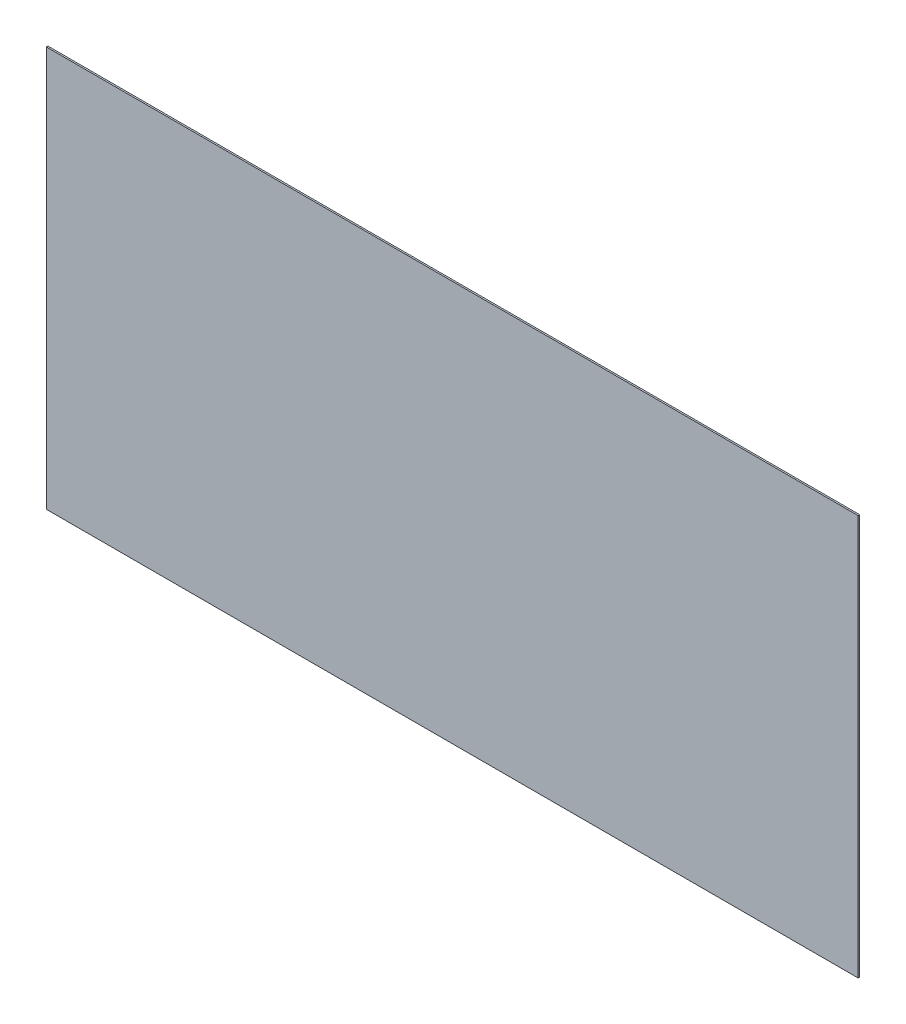
ISO-10303-21;
HEADER;
FILE_DESCRIPTION(('STEP AP214'),'2;1');
FILE_NAME('part.step','',(''),(''),'','','');
FILE_SCHEMA(('AUTOMOTIVE_DESIGN { 1 0 10303 214 1 1 1 1 }'));
ENDSEC;
DATA;
#1=APPLICATION_CONTEXT('core data for automotive mechanical design processes');
#2=APPLICATION_PROTOCOL_DEFINITION('international standard','automotive_design',2000,#1);
#3=PRODUCT_CONTEXT('',#1,'mechanical');
#4=PRODUCT('Part','Part','',(#3));
#5=PRODUCT_RELATED_PRODUCT_CATEGORY('part','',(#4));
#6=PRODUCT_DEFINITION_FORMATION('','',#4);
#7=PRODUCT_DEFINITION_CONTEXT('part definition',#1,'design');
#8=PRODUCT_DEFINITION('design','',#6,#7);
#9=PRODUCT_DEFINITION_SHAPE('','',#8);
#10=(LENGTH_UNIT() NAMED_UNIT(*) SI_UNIT(.MILLI.,.METRE.));
#11=(NAMED_UNIT(*) PLANE_ANGLE_UNIT() SI_UNIT($,.RADIAN.));
#12=(NAMED_UNIT(*) SI_UNIT($,.STERADIAN.) SOLID_ANGLE_UNIT());
#13=UNCERTAINTY_MEASURE_WITH_UNIT(LENGTH_MEASURE(1.E-05),#10,'distance_accuracy_value','');
#14=(GEOMETRIC_REPRESENTATION_CONTEXT(3) GLOBAL_UNCERTAINTY_ASSIGNED_CONTEXT((#13)) GLOBAL_UNIT_ASSIGNED_CONTEXT((#10,
#11,#12)) REPRESENTATION_CONTEXT('',''));
#15=CARTESIAN_POINT('',(0.,0.,0.));
#16=DIRECTION('',(0.,0.,1.));
#17=DIRECTION('',(1.,0.,0.));
#18=AXIS2_PLACEMENT_3D('',#15,#16,#17);
#19=CARTESIAN_POINT('',(0.,128.,0.5));
#20=DIRECTION('',(1.,0.,0.));
#21=DIRECTION('',(0.,0.,-1.));
#22=AXIS2_PLACEMENT_3D('',#19,#20,#21);
#23=PLANE('',#22);
#24=DIRECTION('',(0.,-1.,0.));
#25=VECTOR('',#24,1.);
#26=CARTESIAN_POINT('',(0.,128.,0.));
#27=LINE('',#26,#25);
#28=CARTESIAN_POINT('',(0.,128.,0.));
#29=VERTEX_POINT('',#28);
#30=CARTESIAN_POINT('',(0.,0.,0.));
#31=VERTEX_POINT('',#30);
#32=EDGE_CURVE('E102',#29,#31,#27,.T.);
#33=ORIENTED_EDGE('',*,*,#32,.T.);
#34=DIRECTION('',(0.,0.,-1.));
#35=VECTOR('',#34,1.);
#36=CARTESIAN_POINT('',(0.,0.,0.5));
#37=LINE('',#36,#35);
#38=CARTESIAN_POINT('',(0.,0.,0.5));
#39=VERTEX_POINT('',#38);
#40=EDGE_CURVE('E11',#39,#31,#37,.T.);
#41=ORIENTED_EDGE('',*,*,#40,.F.);
#42=DIRECTION('',(0.,-1.,0.));
#43=VECTOR('',#42,1.);
#44=CARTESIAN_POINT('',(0.,128.,0.5));
#45=LINE('',#44,#43);
#46=CARTESIAN_POINT('',(0.,128.,0.5));
#47=VERTEX_POINT('',#46);
#48=EDGE_CURVE('E95',#47,#39,#45,.T.);
#49=ORIENTED_EDGE('',*,*,#48,.F.);
#50=DIRECTION('',(0.,0.,-1.));
#51=VECTOR('',#50,1.);
#52=CARTESIAN_POINT('',(0.,128.,0.5));
#53=LINE('',#52,#51);
#54=EDGE_CURVE('E99',#47,#29,#53,.T.);
#55=ORIENTED_EDGE('',*,*,#54,.T.);
#56=EDGE_LOOP('',(#33,#41,#49,#55));
#57=FACE_BOUND('',#56,.T.);
#58=ADVANCED_FACE('F41',(#57),#23,.F.);
#59=CARTESIAN_POINT('',(0.,0.,0.5));
#60=DIRECTION('',(0.,1.,0.));
#61=DIRECTION('',(0.,0.,1.));
#62=AXIS2_PLACEMENT_3D('',#59,#60,#61);
#63=PLANE('',#62);
#64=DIRECTION('',(1.,0.,0.));
#65=VECTOR('',#64,1.);
#66=CARTESIAN_POINT('',(0.,0.,0.));
#67=LINE('',#66,#65);
#68=CARTESIAN_POINT('',(259.5,0.,0.));
#69=VERTEX_POINT('',#68);
#70=EDGE_CURVE('E96',#31,#69,#67,.T.);
#71=ORIENTED_EDGE('',*,*,#70,.T.);
#72=DIRECTION('',(0.,0.,-1.));
#73=VECTOR('',#72,1.);
#74=CARTESIAN_POINT('',(259.5,0.,0.5));
#75=LINE('',#74,#73);
#76=CARTESIAN_POINT('',(259.5,0.,0.5));
#77=VERTEX_POINT('',#76);
#78=EDGE_CURVE('E47',#77,#69,#75,.T.);
#79=ORIENTED_EDGE('',*,*,#78,.F.);
#80=DIRECTION('',(1.,0.,0.));
#81=VECTOR('',#80,1.);
#82=CARTESIAN_POINT('',(0.,0.,0.5));
#83=LINE('',#82,#81);
#84=EDGE_CURVE('E87',#39,#77,#83,.T.);
#85=ORIENTED_EDGE('',*,*,#84,.F.);
#86=ORIENTED_EDGE('',*,*,#40,.T.);
#87=EDGE_LOOP('',(#71,#79,#85,#86));
#88=FACE_BOUND('',#87,.T.);
#89=ADVANCED_FACE('F92',(#88),#63,.F.);
#90=CARTESIAN_POINT('',(259.5,0.,0.5));
#91=DIRECTION('',(-1.,0.,0.));
#92=DIRECTION('',(0.,0.,1.));
#93=AXIS2_PLACEMENT_3D('',#90,#91,#92);
#94=PLANE('',#93);
#95=DIRECTION('',(0.,1.,0.));
#96=VECTOR('',#95,1.);
#97=CARTESIAN_POINT('',(259.5,0.,0.));
#98=LINE('',#97,#96);
#99=CARTESIAN_POINT('',(259.5,128.,0.));
#100=VERTEX_POINT('',#99);
#101=EDGE_CURVE('E74',#69,#100,#98,.T.);
#102=ORIENTED_EDGE('',*,*,#101,.T.);
#103=DIRECTION('',(0.,0.,-1.));
#104=VECTOR('',#103,1.);
#105=CARTESIAN_POINT('',(259.5,128.,0.5));
#106=LINE('',#105,#104);
#107=CARTESIAN_POINT('',(259.5,128.,0.5));
#108=VERTEX_POINT('',#107);
#109=EDGE_CURVE('E100',#108,#100,#106,.T.);
#110=ORIENTED_EDGE('',*,*,#109,.F.);
#111=DIRECTION('',(0.,1.,0.));
#112=VECTOR('',#111,1.);
#113=CARTESIAN_POINT('',(259.5,0.,0.5));
#114=LINE('',#113,#112);
#115=EDGE_CURVE('E89',#77,#108,#114,.T.);
#116=ORIENTED_EDGE('',*,*,#115,.F.);
#117=ORIENTED_EDGE('',*,*,#78,.T.);
#118=EDGE_LOOP('',(#102,#110,#116,#117));
#119=FACE_BOUND('',#118,.T.);
#120=ADVANCED_FACE('F98',(#119),#94,.F.);
#121=CARTESIAN_POINT('',(259.5,128.,0.5));
#122=DIRECTION('',(0.,-1.,0.));
#123=DIRECTION('',(0.,0.,-1.));
#124=AXIS2_PLACEMENT_3D('',#121,#122,#123);
#125=PLANE('',#124);
#126=DIRECTION('',(-1.,0.,0.));
#127=VECTOR('',#126,1.);
#128=CARTESIAN_POINT('',(259.5,128.,0.));
#129=LINE('',#128,#127);
#130=EDGE_CURVE('E77',#100,#29,#129,.T.);
#131=ORIENTED_EDGE('',*,*,#130,.T.);
#132=ORIENTED_EDGE('',*,*,#54,.F.);
#133=DIRECTION('',(-1.,0.,0.));
#134=VECTOR('',#133,1.);
#135=CARTESIAN_POINT('',(259.5,128.,0.5));
#136=LINE('',#135,#134);
#137=EDGE_CURVE('E60',#108,#47,#136,.T.);
#138=ORIENTED_EDGE('',*,*,#137,.F.);
#139=ORIENTED_EDGE('',*,*,#109,.T.);
#140=EDGE_LOOP('',(#131,#132,#138,#139));
#141=FACE_BOUND('',#140,.T.);
#142=ADVANCED_FACE('F112',(#141),#125,.F.);
#143=CARTESIAN_POINT('',(0.,0.,0.5));
#144=DIRECTION('',(0.,0.,1.));
#145=DIRECTION('',(1.,0.,0.));
#146=AXIS2_PLACEMENT_3D('',#143,#144,#145);
#147=PLANE('',#146);
#148=ORIENTED_EDGE('',*,*,#48,.T.);
#149=ORIENTED_EDGE('',*,*,#84,.T.);
#150=ORIENTED_EDGE('',*,*,#115,.T.);
#151=ORIENTED_EDGE('',*,*,#137,.T.);
#152=EDGE_LOOP('',(#148,#149,#150,#151));
#153=FACE_BOUND('',#152,.T.);
#154=ADVANCED_FACE('F86',(#153),#147,.T.);
#155=CARTESIAN_POINT('',(0.,0.,0.));
#156=DIRECTION('',(0.,0.,1.));
#157=DIRECTION('',(1.,0.,0.));
#158=AXIS2_PLACEMENT_3D('',#155,#156,#157);
#159=PLANE('',#158);
#160=ORIENTED_EDGE('',*,*,#32,.F.);
#161=ORIENTED_EDGE('',*,*,#130,.F.);
#162=ORIENTED_EDGE('',*,*,#101,.F.);
#163=ORIENTED_EDGE('',*,*,#70,.F.);
#164=EDGE_LOOP('',(#160,#161,#162,#163));
#165=FACE_BOUND('',#164,.T.);
#166=ADVANCED_FACE('F111',(#165),#159,.F.);
#167=CLOSED_SHELL('',(#58,#89,#120,#142,#154,#166));
#168=MANIFOLD_SOLID_BREP('B2',#167);
#169=ADVANCED_BREP_SHAPE_REPRESENTATION('',(#18,#168),#14);
#170=SHAPE_DEFINITION_REPRESENTATION(#9,#169);
ENDSEC;
END-ISO-10303-21;
